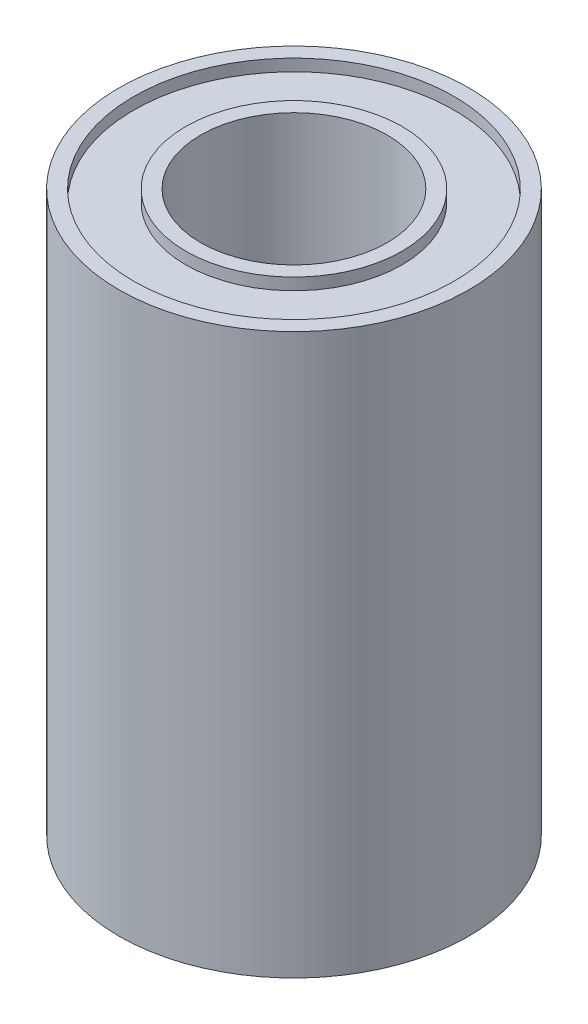
ISO-10303-21;
HEADER;
FILE_DESCRIPTION(('STEP AP214'),'2;1');
FILE_NAME('part.step','',(''),(''),'','','');
FILE_SCHEMA(('AUTOMOTIVE_DESIGN { 1 0 10303 214 1 1 1 1 }'));
ENDSEC;
DATA;
#1=APPLICATION_CONTEXT('core data for automotive mechanical design processes');
#2=APPLICATION_PROTOCOL_DEFINITION('international standard','automotive_design',2000,#1);
#3=PRODUCT_CONTEXT('',#1,'mechanical');
#4=PRODUCT('Part','Part','',(#3));
#5=PRODUCT_RELATED_PRODUCT_CATEGORY('part','',(#4));
#6=PRODUCT_DEFINITION_FORMATION('','',#4);
#7=PRODUCT_DEFINITION_CONTEXT('part definition',#1,'design');
#8=PRODUCT_DEFINITION('design','',#6,#7);
#9=PRODUCT_DEFINITION_SHAPE('','',#8);
#10=(LENGTH_UNIT() NAMED_UNIT(*) SI_UNIT(.MILLI.,.METRE.));
#11=(NAMED_UNIT(*) PLANE_ANGLE_UNIT() SI_UNIT($,.RADIAN.));
#12=(NAMED_UNIT(*) SI_UNIT($,.STERADIAN.) SOLID_ANGLE_UNIT());
#13=UNCERTAINTY_MEASURE_WITH_UNIT(LENGTH_MEASURE(1.E-05),#10,'distance_accuracy_value','');
#14=(GEOMETRIC_REPRESENTATION_CONTEXT(3) GLOBAL_UNCERTAINTY_ASSIGNED_CONTEXT((#13)) GLOBAL_UNIT_ASSIGNED_CONTEXT((#10,
#11,#12)) REPRESENTATION_CONTEXT('',''));
#15=CARTESIAN_POINT('',(0.,0.,0.));
#16=DIRECTION('',(0.,0.,1.));
#17=DIRECTION('',(1.,0.,0.));
#18=AXIS2_PLACEMENT_3D('',#15,#16,#17);
#19=CARTESIAN_POINT('',(0.,-12.,0.));
#20=DIRECTION('',(0.,1.,0.));
#21=DIRECTION('',(0.,0.,1.));
#22=AXIS2_PLACEMENT_3D('',#19,#20,#21);
#23=PLANE('',#22);
#24=CARTESIAN_POINT('',(0.,-12.,0.));
#25=DIRECTION('',(0.,1.,0.));
#26=DIRECTION('',(0.,0.,1.));
#27=AXIS2_PLACEMENT_3D('',#24,#25,#26);
#28=CIRCLE('',#27,4.);
#29=CARTESIAN_POINT('',(0.,-12.,4.));
#30=VERTEX_POINT('',#29);
#31=EDGE_CURVE('E61',#30,#30,#28,.T.);
#32=ORIENTED_EDGE('',*,*,#31,.T.);
#33=EDGE_LOOP('',(#32));
#34=FACE_BOUND('',#33,.T.);
#35=CARTESIAN_POINT('',(0.,-12.,0.));
#36=DIRECTION('',(0.,1.,0.));
#37=DIRECTION('',(0.,0.,1.));
#38=AXIS2_PLACEMENT_3D('',#35,#36,#37);
#39=CIRCLE('',#38,4.635);
#40=CARTESIAN_POINT('',(0.,-12.,4.635));
#41=VERTEX_POINT('',#40);
#42=EDGE_CURVE('E92',#41,#41,#39,.T.);
#43=ORIENTED_EDGE('',*,*,#42,.F.);
#44=EDGE_LOOP('',(#43));
#45=FACE_BOUND('',#44,.T.);
#46=ADVANCED_FACE('F45',(#34,#45),#23,.F.);
#47=CARTESIAN_POINT('',(0.,12.,0.));
#48=DIRECTION('',(0.,1.,0.));
#49=DIRECTION('',(0.,0.,1.));
#50=AXIS2_PLACEMENT_3D('',#47,#48,#49);
#51=PLANE('',#50);
#52=CARTESIAN_POINT('',(0.,12.,0.));
#53=DIRECTION('',(0.,1.,0.));
#54=DIRECTION('',(0.,0.,1.));
#55=AXIS2_PLACEMENT_3D('',#52,#53,#54);
#56=CIRCLE('',#55,4.);
#57=CARTESIAN_POINT('',(0.,12.,4.));
#58=VERTEX_POINT('',#57);
#59=EDGE_CURVE('E59',#58,#58,#56,.T.);
#60=ORIENTED_EDGE('',*,*,#59,.F.);
#61=EDGE_LOOP('',(#60));
#62=FACE_BOUND('',#61,.T.);
#63=CARTESIAN_POINT('',(0.,12.,0.));
#64=DIRECTION('',(0.,1.,0.));
#65=DIRECTION('',(0.,0.,1.));
#66=AXIS2_PLACEMENT_3D('',#63,#64,#65);
#67=CIRCLE('',#66,4.635);
#68=CARTESIAN_POINT('',(0.,12.,4.635));
#69=VERTEX_POINT('',#68);
#70=EDGE_CURVE('E76',#69,#69,#67,.T.);
#71=ORIENTED_EDGE('',*,*,#70,.T.);
#72=EDGE_LOOP('',(#71));
#73=FACE_BOUND('',#72,.T.);
#74=ADVANCED_FACE('F110',(#62,#73),#51,.T.);
#75=CARTESIAN_POINT('',(0.,12.,0.));
#76=DIRECTION('',(0.,1.,0.));
#77=DIRECTION('',(0.,0.,1.));
#78=AXIS2_PLACEMENT_3D('',#75,#76,#77);
#79=CIRCLE('',#78,6.865);
#80=CARTESIAN_POINT('',(0.,12.,6.865));
#81=VERTEX_POINT('',#80);
#82=EDGE_CURVE('E68',#81,#81,#79,.T.);
#83=ORIENTED_EDGE('',*,*,#82,.F.);
#84=EDGE_LOOP('',(#83));
#85=FACE_BOUND('',#84,.T.);
#86=CARTESIAN_POINT('',(0.,12.,0.));
#87=DIRECTION('',(0.,1.,0.));
#88=DIRECTION('',(0.,0.,1.));
#89=AXIS2_PLACEMENT_3D('',#86,#87,#88);
#90=CIRCLE('',#89,7.5);
#91=CARTESIAN_POINT('',(0.,12.,7.5));
#92=VERTEX_POINT('',#91);
#93=EDGE_CURVE('E10',#92,#92,#90,.T.);
#94=ORIENTED_EDGE('',*,*,#93,.T.);
#95=EDGE_LOOP('',(#94));
#96=FACE_BOUND('',#95,.T.);
#97=ADVANCED_FACE('F118',(#85,#96),#51,.T.);
#98=CARTESIAN_POINT('',(0.,-12.,0.));
#99=DIRECTION('',(0.,1.,0.));
#100=DIRECTION('',(0.,0.,1.));
#101=AXIS2_PLACEMENT_3D('',#98,#99,#100);
#102=CIRCLE('',#101,6.865);
#103=CARTESIAN_POINT('',(0.,-12.,6.865));
#104=VERTEX_POINT('',#103);
#105=EDGE_CURVE('E84',#104,#104,#102,.T.);
#106=ORIENTED_EDGE('',*,*,#105,.T.);
#107=EDGE_LOOP('',(#106));
#108=FACE_BOUND('',#107,.T.);
#109=CARTESIAN_POINT('',(0.,-12.,0.));
#110=DIRECTION('',(0.,1.,0.));
#111=DIRECTION('',(0.,0.,1.));
#112=AXIS2_PLACEMENT_3D('',#109,#110,#111);
#113=CIRCLE('',#112,7.5);
#114=CARTESIAN_POINT('',(0.,-12.,7.5));
#115=VERTEX_POINT('',#114);
#116=EDGE_CURVE('E49',#115,#115,#113,.T.);
#117=ORIENTED_EDGE('',*,*,#116,.F.);
#118=EDGE_LOOP('',(#117));
#119=FACE_BOUND('',#118,.T.);
#120=ADVANCED_FACE('F112',(#108,#119),#23,.F.);
#121=CARTESIAN_POINT('',(0.,12.,0.));
#122=DIRECTION('',(0.,-1.,0.));
#123=DIRECTION('',(0.,0.,-1.));
#124=AXIS2_PLACEMENT_3D('',#121,#122,#123);
#125=CYLINDRICAL_SURFACE('',#124,7.5);
#126=ORIENTED_EDGE('',*,*,#93,.F.);
#127=EDGE_LOOP('',(#126));
#128=FACE_BOUND('',#127,.T.);
#129=ORIENTED_EDGE('',*,*,#116,.T.);
#130=EDGE_LOOP('',(#129));
#131=FACE_BOUND('',#130,.T.);
#132=ADVANCED_FACE('F47',(#128,#131),#125,.T.);
#133=CARTESIAN_POINT('',(0.,12.,0.));
#134=DIRECTION('',(0.,-1.,0.));
#135=DIRECTION('',(0.,0.,-1.));
#136=AXIS2_PLACEMENT_3D('',#133,#134,#135);
#137=CYLINDRICAL_SURFACE('',#136,4.);
#138=ORIENTED_EDGE('',*,*,#59,.T.);
#139=EDGE_LOOP('',(#138));
#140=FACE_BOUND('',#139,.T.);
#141=ORIENTED_EDGE('',*,*,#31,.F.);
#142=EDGE_LOOP('',(#141));
#143=FACE_BOUND('',#142,.T.);
#144=ADVANCED_FACE('F126',(#140,#143),#137,.F.);
#145=CARTESIAN_POINT('',(0.,11.492,0.));
#146=DIRECTION('',(0.,1.,0.));
#147=DIRECTION('',(0.,0.,1.));
#148=AXIS2_PLACEMENT_3D('',#145,#146,#147);
#149=CYLINDRICAL_SURFACE('',#148,6.865);
#150=CARTESIAN_POINT('',(0.,11.492,0.));
#151=DIRECTION('',(0.,1.,0.));
#152=DIRECTION('',(0.,0.,1.));
#153=AXIS2_PLACEMENT_3D('',#150,#151,#152);
#154=CIRCLE('',#153,6.865);
#155=CARTESIAN_POINT('',(0.,11.492,6.865));
#156=VERTEX_POINT('',#155);
#157=EDGE_CURVE('E65',#156,#156,#154,.T.);
#158=ORIENTED_EDGE('',*,*,#157,.F.);
#159=EDGE_LOOP('',(#158));
#160=FACE_BOUND('',#159,.T.);
#161=ORIENTED_EDGE('',*,*,#82,.T.);
#162=EDGE_LOOP('',(#161));
#163=FACE_BOUND('',#162,.T.);
#164=ADVANCED_FACE('F149',(#160,#163),#149,.F.);
#165=CARTESIAN_POINT('',(0.,11.492,0.));
#166=DIRECTION('',(0.,1.,0.));
#167=DIRECTION('',(0.,0.,1.));
#168=AXIS2_PLACEMENT_3D('',#165,#166,#167);
#169=PLANE('',#168);
#170=CARTESIAN_POINT('',(0.,11.492,0.));
#171=DIRECTION('',(0.,1.,0.));
#172=DIRECTION('',(0.,0.,1.));
#173=AXIS2_PLACEMENT_3D('',#170,#171,#172);
#174=CIRCLE('',#173,4.635);
#175=CARTESIAN_POINT('',(0.,11.492,4.635));
#176=VERTEX_POINT('',#175);
#177=EDGE_CURVE('E72',#176,#176,#174,.T.);
#178=ORIENTED_EDGE('',*,*,#177,.F.);
#179=EDGE_LOOP('',(#178));
#180=FACE_BOUND('',#179,.T.);
#181=ORIENTED_EDGE('',*,*,#157,.T.);
#182=EDGE_LOOP('',(#181));
#183=FACE_BOUND('',#182,.T.);
#184=ADVANCED_FACE('F145',(#180,#183),#169,.T.);
#185=CARTESIAN_POINT('',(0.,11.492,0.));
#186=DIRECTION('',(0.,1.,0.));
#187=DIRECTION('',(0.,0.,1.));
#188=AXIS2_PLACEMENT_3D('',#185,#186,#187);
#189=CYLINDRICAL_SURFACE('',#188,4.635);
#190=ORIENTED_EDGE('',*,*,#177,.T.);
#191=EDGE_LOOP('',(#190));
#192=FACE_BOUND('',#191,.T.);
#193=ORIENTED_EDGE('',*,*,#70,.F.);
#194=EDGE_LOOP('',(#193));
#195=FACE_BOUND('',#194,.T.);
#196=ADVANCED_FACE('F140',(#192,#195),#189,.T.);
#197=CARTESIAN_POINT('',(0.,-11.492,0.));
#198=DIRECTION('',(0.,-1.,0.));
#199=DIRECTION('',(0.,0.,1.));
#200=AXIS2_PLACEMENT_3D('',#197,#198,#199);
#201=PLANE('',#200);
#202=CARTESIAN_POINT('',(0.,-11.492,0.));
#203=DIRECTION('',(0.,1.,0.));
#204=DIRECTION('',(0.,0.,1.));
#205=AXIS2_PLACEMENT_3D('',#202,#203,#204);
#206=CIRCLE('',#205,6.865);
#207=CARTESIAN_POINT('',(0.,-11.492,6.865));
#208=VERTEX_POINT('',#207);
#209=EDGE_CURVE('E80',#208,#208,#206,.T.);
#210=ORIENTED_EDGE('',*,*,#209,.F.);
#211=EDGE_LOOP('',(#210));
#212=FACE_BOUND('',#211,.T.);
#213=CARTESIAN_POINT('',(0.,-11.492,0.));
#214=DIRECTION('',(0.,1.,0.));
#215=DIRECTION('',(0.,0.,1.));
#216=AXIS2_PLACEMENT_3D('',#213,#214,#215);
#217=CIRCLE('',#216,4.635);
#218=CARTESIAN_POINT('',(0.,-11.492,4.635));
#219=VERTEX_POINT('',#218);
#220=EDGE_CURVE('E88',#219,#219,#217,.T.);
#221=ORIENTED_EDGE('',*,*,#220,.T.);
#222=EDGE_LOOP('',(#221));
#223=FACE_BOUND('',#222,.T.);
#224=ADVANCED_FACE('F100',(#212,#223),#201,.T.);
#225=CARTESIAN_POINT('',(0.,-11.492,0.));
#226=DIRECTION('',(0.,-1.,0.));
#227=DIRECTION('',(0.,0.,-1.));
#228=AXIS2_PLACEMENT_3D('',#225,#226,#227);
#229=CYLINDRICAL_SURFACE('',#228,6.865);
#230=ORIENTED_EDGE('',*,*,#209,.T.);
#231=EDGE_LOOP('',(#230));
#232=FACE_BOUND('',#231,.T.);
#233=ORIENTED_EDGE('',*,*,#105,.F.);
#234=EDGE_LOOP('',(#233));
#235=FACE_BOUND('',#234,.T.);
#236=ADVANCED_FACE('F105',(#232,#235),#229,.F.);
#237=CARTESIAN_POINT('',(0.,-11.492,0.));
#238=DIRECTION('',(0.,-1.,0.));
#239=DIRECTION('',(0.,0.,-1.));
#240=AXIS2_PLACEMENT_3D('',#237,#238,#239);
#241=CYLINDRICAL_SURFACE('',#240,4.635);
#242=ORIENTED_EDGE('',*,*,#220,.F.);
#243=EDGE_LOOP('',(#242));
#244=FACE_BOUND('',#243,.T.);
#245=ORIENTED_EDGE('',*,*,#42,.T.);
#246=EDGE_LOOP('',(#245));
#247=FACE_BOUND('',#246,.T.);
#248=ADVANCED_FACE('F102',(#244,#247),#241,.T.);
#249=CLOSED_SHELL('',(#46,#74,#97,#120,#132,#144,#164,#184,#196,#224,#236,#248));
#250=MANIFOLD_SOLID_BREP('B2',#249);
#251=ADVANCED_BREP_SHAPE_REPRESENTATION('',(#18,#250),#14);
#252=SHAPE_DEFINITION_REPRESENTATION(#9,#251);
ENDSEC;
END-ISO-10303-21;
